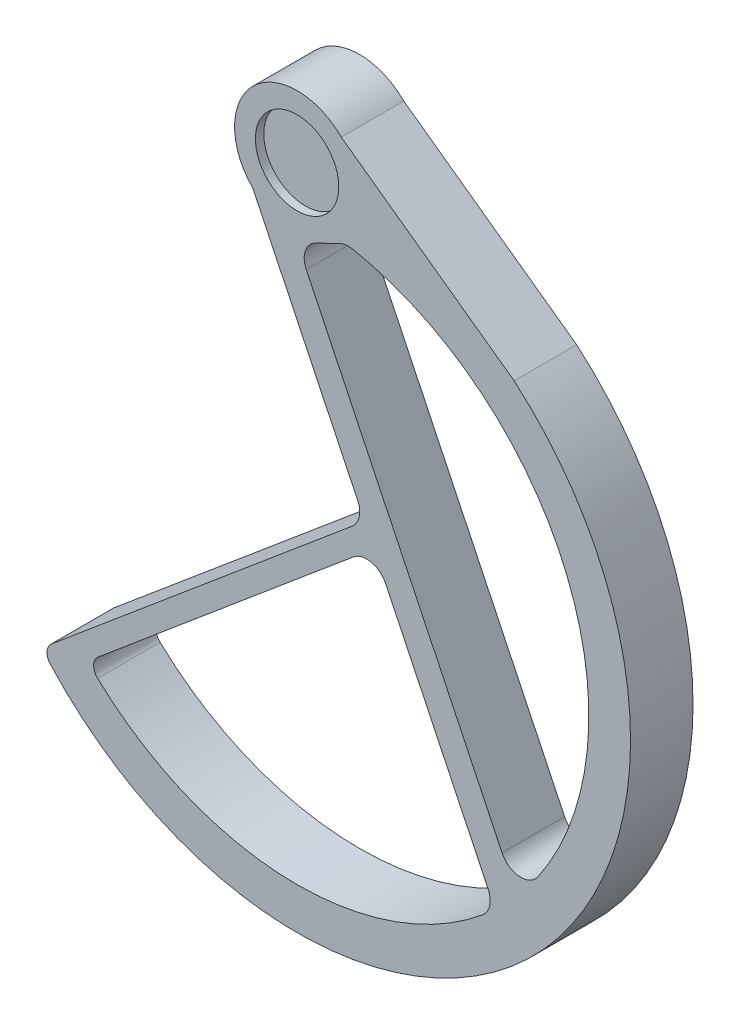
ISO-10303-21;
HEADER;
FILE_DESCRIPTION(('STEP AP214'),'2;1');
FILE_NAME('part.step','',(''),(''),'','','');
FILE_SCHEMA(('AUTOMOTIVE_DESIGN { 1 0 10303 214 1 1 1 1 }'));
ENDSEC;
DATA;
#1=APPLICATION_CONTEXT('core data for automotive mechanical design processes');
#2=APPLICATION_PROTOCOL_DEFINITION('international standard','automotive_design',2000,#1);
#3=PRODUCT_CONTEXT('',#1,'mechanical');
#4=PRODUCT('Part','Part','',(#3));
#5=PRODUCT_RELATED_PRODUCT_CATEGORY('part','',(#4));
#6=PRODUCT_DEFINITION_FORMATION('','',#4);
#7=PRODUCT_DEFINITION_CONTEXT('part definition',#1,'design');
#8=PRODUCT_DEFINITION('design','',#6,#7);
#9=PRODUCT_DEFINITION_SHAPE('','',#8);
#10=(LENGTH_UNIT() NAMED_UNIT(*) SI_UNIT(.MILLI.,.METRE.));
#11=(NAMED_UNIT(*) PLANE_ANGLE_UNIT() SI_UNIT($,.RADIAN.));
#12=(NAMED_UNIT(*) SI_UNIT($,.STERADIAN.) SOLID_ANGLE_UNIT());
#13=UNCERTAINTY_MEASURE_WITH_UNIT(LENGTH_MEASURE(1.E-05),#10,'distance_accuracy_value','');
#14=(GEOMETRIC_REPRESENTATION_CONTEXT(3) GLOBAL_UNCERTAINTY_ASSIGNED_CONTEXT((#13)) GLOBAL_UNIT_ASSIGNED_CONTEXT((#10,
#11,#12)) REPRESENTATION_CONTEXT('',''));
#15=CARTESIAN_POINT('',(0.,0.,0.));
#16=DIRECTION('',(0.,0.,1.));
#17=DIRECTION('',(1.,0.,0.));
#18=AXIS2_PLACEMENT_3D('',#15,#16,#17);
#19=CARTESIAN_POINT('',(-12.7570586950624,-6.1348621133076,15.));
#20=DIRECTION('',(0.901206602628173,0.433389731511241,0.));
#21=DIRECTION('',(-0.433389731511241,0.901206602628173,0.));
#22=AXIS2_PLACEMENT_3D('',#19,#20,#21);
#23=PLANE('',#22);
#24=DIRECTION('',(0.433389731511241,-0.901206602628173,0.));
#25=VECTOR('',#24,1.);
#26=CARTESIAN_POINT('',(-12.7570586950624,-6.1348621133076,0.));
#27=LINE('',#26,#25);
#28=CARTESIAN_POINT('',(21.2324006956412,-76.8137984043253,0.));
#29=VERTEX_POINT('',#28);
#30=CARTESIAN_POINT('',(45.844843506453,-127.9938203457,0.));
#31=VERTEX_POINT('',#30);
#32=EDGE_CURVE('E278',#29,#31,#27,.T.);
#33=ORIENTED_EDGE('',*,*,#32,.T.);
#34=DIRECTION('',(0.,0.,-1.));
#35=VECTOR('',#34,1.);
#36=CARTESIAN_POINT('',(45.844843506453,-127.9938203457,15.));
#37=LINE('',#36,#35);
#38=CARTESIAN_POINT('',(45.844843506453,-127.9938203457,15.));
#39=VERTEX_POINT('',#38);
#40=EDGE_CURVE('E11',#39,#31,#37,.T.);
#41=ORIENTED_EDGE('',*,*,#40,.F.);
#42=DIRECTION('',(0.433389731511241,-0.901206602628173,0.));
#43=VECTOR('',#42,1.);
#44=CARTESIAN_POINT('',(-12.7570586950624,-6.1348621133076,15.));
#45=LINE('',#44,#43);
#46=CARTESIAN_POINT('',(21.2324006956412,-76.8137984043253,15.));
#47=VERTEX_POINT('',#46);
#48=EDGE_CURVE('E244',#47,#39,#45,.T.);
#49=ORIENTED_EDGE('',*,*,#48,.F.);
#50=DIRECTION('',(0.,0.,-1.));
#51=VECTOR('',#50,1.);
#52=CARTESIAN_POINT('',(21.2324006956412,-76.8137984043253,15.));
#53=LINE('',#52,#51);
#54=EDGE_CURVE('E292',#47,#29,#53,.T.);
#55=ORIENTED_EDGE('',*,*,#54,.T.);
#56=EDGE_LOOP('',(#33,#41,#49,#55));
#57=FACE_BOUND('',#56,.T.);
#58=ADVANCED_FACE('F35',(#57),#23,.F.);
#59=CARTESIAN_POINT('',(41.3388104933121,-130.160769003256,15.));
#60=DIRECTION('',(0.,0.,-1.));
#61=DIRECTION('',(-1.,0.,0.));
#62=AXIS2_PLACEMENT_3D('',#59,#60,#61);
#63=CYLINDRICAL_SURFACE('',#62,4.99999999999999);
#64=CARTESIAN_POINT('',(41.3388104933121,-130.160769003256,0.));
#65=DIRECTION('',(0.,0.,1.));
#66=DIRECTION('',(1.,0.,0.));
#67=AXIS2_PLACEMENT_3D('',#64,#65,#66);
#68=CIRCLE('',#67,4.99999999999999);
#69=CARTESIAN_POINT('',(44.5187189927976,-134.019289695814,0.));
#70=VERTEX_POINT('',#69);
#71=EDGE_CURVE('E281',#31,#70,#68,.F.);
#72=ORIENTED_EDGE('',*,*,#71,.T.);
#73=DIRECTION('',(0.,0.,-1.));
#74=VECTOR('',#73,1.);
#75=CARTESIAN_POINT('',(44.5187189927976,-134.019289695814,15.));
#76=LINE('',#75,#74);
#77=CARTESIAN_POINT('',(44.5187189927976,-134.019289695814,15.));
#78=VERTEX_POINT('',#77);
#79=EDGE_CURVE('E44',#78,#70,#76,.T.);
#80=ORIENTED_EDGE('',*,*,#79,.F.);
#81=CARTESIAN_POINT('',(41.3388104933121,-130.160769003256,15.));
#82=DIRECTION('',(0.,0.,1.));
#83=DIRECTION('',(1.,0.,0.));
#84=AXIS2_PLACEMENT_3D('',#81,#82,#83);
#85=CIRCLE('',#84,4.99999999999999);
#86=EDGE_CURVE('E247',#39,#78,#85,.F.);
#87=ORIENTED_EDGE('',*,*,#86,.F.);
#88=ORIENTED_EDGE('',*,*,#40,.T.);
#89=EDGE_LOOP('',(#72,#80,#87,#88));
#90=FACE_BOUND('',#89,.T.);
#91=ADVANCED_FACE('F358',(#90),#63,.F.);
#92=CARTESIAN_POINT('',(0.,-80.,15.));
#93=DIRECTION('',(0.,0.,-1.));
#94=DIRECTION('',(-1.,0.,0.));
#95=AXIS2_PLACEMENT_3D('',#92,#93,#94);
#96=CYLINDRICAL_SURFACE('',#95,70.);
#97=CARTESIAN_POINT('',(0.,-80.,0.));
#98=DIRECTION('',(0.,0.,1.));
#99=DIRECTION('',(1.,0.,0.));
#100=AXIS2_PLACEMENT_3D('',#97,#98,#99);
#101=CIRCLE('',#100,70.);
#102=CARTESIAN_POINT('',(-47.870174388264,-131.072951785042,0.));
#103=VERTEX_POINT('',#102);
#104=EDGE_CURVE('E284',#103,#70,#101,.T.);
#105=ORIENTED_EDGE('',*,*,#104,.F.);
#106=DIRECTION('',(0.,0.,-1.));
#107=VECTOR('',#106,1.);
#108=CARTESIAN_POINT('',(-47.870174388264,-131.072951785042,15.));
#109=LINE('',#108,#107);
#110=CARTESIAN_POINT('',(-47.870174388264,-131.072951785042,15.));
#111=VERTEX_POINT('',#110);
#112=EDGE_CURVE('E301',#111,#103,#109,.T.);
#113=ORIENTED_EDGE('',*,*,#112,.F.);
#114=CARTESIAN_POINT('',(0.,-80.,15.));
#115=DIRECTION('',(0.,0.,1.));
#116=DIRECTION('',(1.,0.,0.));
#117=AXIS2_PLACEMENT_3D('',#114,#115,#116);
#118=CIRCLE('',#117,70.);
#119=EDGE_CURVE('E249',#111,#78,#118,.T.);
#120=ORIENTED_EDGE('',*,*,#119,.T.);
#121=ORIENTED_EDGE('',*,*,#79,.T.);
#122=EDGE_LOOP('',(#105,#113,#120,#121));
#123=FACE_BOUND('',#122,.T.);
#124=ADVANCED_FACE('F364',(#123),#96,.F.);
#125=CARTESIAN_POINT('',(-45.8185954859101,-128.884110994254,15.));
#126=DIRECTION('',(0.,0.,-1.));
#127=DIRECTION('',(-1.,0.,0.));
#128=AXIS2_PLACEMENT_3D('',#125,#126,#127);
#129=CYLINDRICAL_SURFACE('',#128,2.99999999999979);
#130=CARTESIAN_POINT('',(-45.8185954859101,-128.884110994254,0.));
#131=DIRECTION('',(0.,0.,1.));
#132=DIRECTION('',(1.,0.,0.));
#133=AXIS2_PLACEMENT_3D('',#130,#131,#132);
#134=CIRCLE('',#133,2.99999999999979);
#135=CARTESIAN_POINT('',(-47.7476784165524,-126.586582094174,0.));
#136=VERTEX_POINT('',#135);
#137=EDGE_CURVE('E287',#103,#136,#134,.F.);
#138=ORIENTED_EDGE('',*,*,#137,.T.);
#139=DIRECTION('',(0.,0.,-1.));
#140=VECTOR('',#139,1.);
#141=CARTESIAN_POINT('',(-47.7476784165524,-126.586582094174,15.));
#142=LINE('',#141,#140);
#143=CARTESIAN_POINT('',(-47.7476784165524,-126.586582094174,15.));
#144=VERTEX_POINT('',#143);
#145=EDGE_CURVE('E298',#144,#136,#142,.T.);
#146=ORIENTED_EDGE('',*,*,#145,.F.);
#147=CARTESIAN_POINT('',(-45.8185954859101,-128.884110994254,15.));
#148=DIRECTION('',(0.,0.,1.));
#149=DIRECTION('',(1.,0.,0.));
#150=AXIS2_PLACEMENT_3D('',#147,#148,#149);
#151=CIRCLE('',#150,2.99999999999979);
#152=EDGE_CURVE('E252',#111,#144,#151,.F.);
#153=ORIENTED_EDGE('',*,*,#152,.F.);
#154=ORIENTED_EDGE('',*,*,#112,.T.);
#155=EDGE_LOOP('',(#138,#146,#153,#154));
#156=FACE_BOUND('',#155,.T.);
#157=ADVANCED_FACE('F370',(#156),#129,.F.);
#158=CARTESIAN_POINT('',(42.5956727933285,-50.7312504333006,15.));
#159=DIRECTION('',(-0.643027643547508,0.765842966693394,0.));
#160=DIRECTION('',(-0.765842966693394,-0.643027643547508,0.));
#161=AXIS2_PLACEMENT_3D('',#158,#159,#160);
#162=PLANE('',#161);
#163=DIRECTION('',(0.765842966693394,0.643027643547508,0.));
#164=VECTOR('',#163,1.);
#165=CARTESIAN_POINT('',(42.5956727933285,-50.7312504333006,0.));
#166=LINE('',#165,#164);
#167=CARTESIAN_POINT('',(13.5112294647628,-75.1515322284145,0.));
#168=VERTEX_POINT('',#167);
#169=EDGE_CURVE('E289',#136,#168,#166,.T.);
#170=ORIENTED_EDGE('',*,*,#169,.T.);
#171=DIRECTION('',(0.,0.,-1.));
#172=VECTOR('',#171,1.);
#173=CARTESIAN_POINT('',(13.5112294647628,-75.1515322284145,15.));
#174=LINE('',#173,#172);
#175=CARTESIAN_POINT('',(13.5112294647628,-75.1515322284145,15.));
#176=VERTEX_POINT('',#175);
#177=EDGE_CURVE('E295',#176,#168,#174,.T.);
#178=ORIENTED_EDGE('',*,*,#177,.F.);
#179=DIRECTION('',(0.765842966693394,0.643027643547508,0.));
#180=VECTOR('',#179,1.);
#181=CARTESIAN_POINT('',(42.5956727933285,-50.7312504333006,15.));
#182=LINE('',#181,#180);
#183=EDGE_CURVE('E254',#144,#176,#182,.T.);
#184=ORIENTED_EDGE('',*,*,#183,.F.);
#185=ORIENTED_EDGE('',*,*,#145,.T.);
#186=EDGE_LOOP('',(#170,#178,#184,#185));
#187=FACE_BOUND('',#186,.T.);
#188=ADVANCED_FACE('F374',(#187),#162,.F.);
#189=CARTESIAN_POINT('',(10.0302471408598,-65.0565868768263,15.));
#190=DIRECTION('',(0.,0.,-1.));
#191=DIRECTION('',(-1.,0.,0.));
#192=AXIS2_PLACEMENT_3D('',#189,#190,#191);
#193=CYLINDRICAL_SURFACE('',#192,5.);
#194=CARTESIAN_POINT('',(10.0302471408598,-65.0565868768263,0.));
#195=DIRECTION('',(0.,0.,1.));
#196=DIRECTION('',(1.,0.,0.));
#197=AXIS2_PLACEMENT_3D('',#194,#195,#196);
#198=CIRCLE('',#197,5.);
#199=CARTESIAN_POINT('',(13.2441851892925,-68.8868090924212,0.));
#200=VERTEX_POINT('',#199);
#201=CARTESIAN_POINT('',(14.5362801540007,-62.8896382192701,0.));
#202=VERTEX_POINT('',#201);
#203=EDGE_CURVE('E217',#200,#202,#198,.T.);
#204=ORIENTED_EDGE('',*,*,#203,.F.);
#205=DIRECTION('',(0.,0.,-1.));
#206=VECTOR('',#205,1.);
#207=CARTESIAN_POINT('',(13.2441851892925,-68.8868090924212,15.));
#208=LINE('',#207,#206);
#209=CARTESIAN_POINT('',(13.2441851892925,-68.8868090924212,15.));
#210=VERTEX_POINT('',#209);
#211=EDGE_CURVE('E39',#210,#200,#208,.T.);
#212=ORIENTED_EDGE('',*,*,#211,.F.);
#213=CARTESIAN_POINT('',(10.0302471408598,-65.0565868768263,15.));
#214=DIRECTION('',(0.,0.,1.));
#215=DIRECTION('',(1.,0.,0.));
#216=AXIS2_PLACEMENT_3D('',#213,#214,#215);
#217=CIRCLE('',#216,5.);
#218=CARTESIAN_POINT('',(14.5362801540007,-62.8896382192701,15.));
#219=VERTEX_POINT('',#218);
#220=EDGE_CURVE('E225',#210,#219,#217,.T.);
#221=ORIENTED_EDGE('',*,*,#220,.T.);
#222=DIRECTION('',(0.,0.,-1.));
#223=VECTOR('',#222,1.);
#224=CARTESIAN_POINT('',(14.5362801540007,-62.8896382192701,15.));
#225=LINE('',#224,#223);
#226=EDGE_CURVE('E258',#219,#202,#225,.T.);
#227=ORIENTED_EDGE('',*,*,#226,.T.);
#228=EDGE_LOOP('',(#204,#212,#221,#227));
#229=FACE_BOUND('',#228,.T.);
#230=ADVANCED_FACE('F37',(#229),#193,.F.);
#231=CARTESIAN_POINT('',(39.3923101204882,-46.9459271066778,15.));
#232=DIRECTION('',(-0.642787609686534,0.766044443118983,0.));
#233=DIRECTION('',(-0.766044443118982,-0.642787609686534,0.));
#234=AXIS2_PLACEMENT_3D('',#231,#232,#233);
#235=PLANE('',#234);
#236=DIRECTION('',(0.766044443118982,0.642787609686534,0.));
#237=VECTOR('',#236,1.);
#238=CARTESIAN_POINT('',(39.3923101204882,-46.9459271066778,0.));
#239=LINE('',#238,#237);
#240=CARTESIAN_POINT('',(-58.9406362868111,-129.457066169617,0.));
#241=VERTEX_POINT('',#240);
#242=EDGE_CURVE('E261',#241,#200,#239,.T.);
#243=ORIENTED_EDGE('',*,*,#242,.F.);
#244=DIRECTION('',(0.,0.,-1.));
#245=VECTOR('',#244,1.);
#246=CARTESIAN_POINT('',(-58.9406362868111,-129.457066169617,15.));
#247=LINE('',#246,#245);
#248=CARTESIAN_POINT('',(-58.9406362868111,-129.457066169617,15.));
#249=VERTEX_POINT('',#248);
#250=EDGE_CURVE('E313',#249,#241,#247,.T.);
#251=ORIENTED_EDGE('',*,*,#250,.F.);
#252=DIRECTION('',(0.766044443118982,0.642787609686534,0.));
#253=VECTOR('',#252,1.);
#254=CARTESIAN_POINT('',(39.3923101204882,-46.9459271066778,15.));
#255=LINE('',#254,#253);
#256=EDGE_CURVE('E228',#249,#210,#255,.T.);
#257=ORIENTED_EDGE('',*,*,#256,.T.);
#258=ORIENTED_EDGE('',*,*,#211,.T.);
#259=EDGE_LOOP('',(#243,#251,#257,#258));
#260=FACE_BOUND('',#259,.T.);
#261=ADVANCED_FACE('F319',(#260),#235,.T.);
#262=CARTESIAN_POINT('',(-57.0122734577518,-131.755199498973,15.));
#263=DIRECTION('',(0.,0.,-1.));
#264=DIRECTION('',(-1.,0.,0.));
#265=AXIS2_PLACEMENT_3D('',#262,#263,#264);
#266=CYLINDRICAL_SURFACE('',#265,2.99999999999976);
#267=CARTESIAN_POINT('',(-57.0122734577518,-131.755199498973,0.));
#268=DIRECTION('',(0.,0.,1.));
#269=DIRECTION('',(1.,0.,0.));
#270=AXIS2_PLACEMENT_3D('',#267,#268,#269);
#271=CIRCLE('',#270,2.99999999999976);
#272=CARTESIAN_POINT('',(-59.2335308651964,-133.771635843089,0.));
#273=VERTEX_POINT('',#272);
#274=EDGE_CURVE('E264',#273,#241,#271,.F.);
#275=ORIENTED_EDGE('',*,*,#274,.F.);
#276=DIRECTION('',(0.,0.,-1.));
#277=VECTOR('',#276,1.);
#278=CARTESIAN_POINT('',(-59.2335308651964,-133.771635843089,15.));
#279=LINE('',#278,#277);
#280=CARTESIAN_POINT('',(-59.2335308651964,-133.771635843089,15.));
#281=VERTEX_POINT('',#280);
#282=EDGE_CURVE('E312',#281,#273,#279,.T.);
#283=ORIENTED_EDGE('',*,*,#282,.F.);
#284=CARTESIAN_POINT('',(-57.0122734577518,-131.755199498973,15.));
#285=DIRECTION('',(0.,0.,1.));
#286=DIRECTION('',(1.,0.,0.));
#287=AXIS2_PLACEMENT_3D('',#284,#285,#286);
#288=CIRCLE('',#287,2.99999999999976);
#289=EDGE_CURVE('E232',#281,#249,#288,.F.);
#290=ORIENTED_EDGE('',*,*,#289,.T.);
#291=ORIENTED_EDGE('',*,*,#250,.T.);
#292=EDGE_LOOP('',(#275,#283,#290,#291));
#293=FACE_BOUND('',#292,.T.);
#294=ADVANCED_FACE('F327',(#293),#266,.T.);
#295=CARTESIAN_POINT('',(0.,-80.,15.));
#296=DIRECTION('',(0.,0.,-1.));
#297=DIRECTION('',(-1.,0.,0.));
#298=AXIS2_PLACEMENT_3D('',#295,#296,#297);
#299=CYLINDRICAL_SURFACE('',#298,80.);
#300=CARTESIAN_POINT('',(0.,-80.,0.));
#301=DIRECTION('',(0.,0.,1.));
#302=DIRECTION('',(1.,0.,0.));
#303=AXIS2_PLACEMENT_3D('',#300,#301,#302);
#304=CIRCLE('',#303,80.);
#305=CARTESIAN_POINT('',(52.0761789176773,-19.2705047828153,0.));
#306=VERTEX_POINT('',#305);
#307=EDGE_CURVE('E267',#273,#306,#304,.T.);
#308=ORIENTED_EDGE('',*,*,#307,.T.);
#309=DIRECTION('',(0.,0.,-1.));
#310=VECTOR('',#309,1.);
#311=CARTESIAN_POINT('',(52.0761789176773,-19.2705047828153,15.));
#312=LINE('',#311,#310);
#313=CARTESIAN_POINT('',(52.0761789176773,-19.2705047828153,15.));
#314=VERTEX_POINT('',#313);
#315=EDGE_CURVE('E310',#314,#306,#312,.T.);
#316=ORIENTED_EDGE('',*,*,#315,.F.);
#317=CARTESIAN_POINT('',(0.,-80.,15.));
#318=DIRECTION('',(0.,0.,1.));
#319=DIRECTION('',(1.,0.,0.));
#320=AXIS2_PLACEMENT_3D('',#317,#318,#319);
#321=CIRCLE('',#320,80.);
#322=EDGE_CURVE('E235',#281,#314,#321,.T.);
#323=ORIENTED_EDGE('',*,*,#322,.F.);
#324=ORIENTED_EDGE('',*,*,#282,.T.);
#325=EDGE_LOOP('',(#308,#316,#323,#324));
#326=FACE_BOUND('',#325,.T.);
#327=ADVANCED_FACE('F332',(#326),#299,.T.);
#328=CARTESIAN_POINT('',(8.65474635415258,12.0128323695446,15.));
#329=DIRECTION('',(0.584549661802916,0.811357931424902,0.));
#330=DIRECTION('',(-0.811357931424902,0.584549661802916,0.));
#331=AXIS2_PLACEMENT_3D('',#328,#329,#330);
#332=PLANE('',#331);
#333=DIRECTION('',(0.811357931424902,-0.584549661802916,0.));
#334=VECTOR('',#333,1.);
#335=CARTESIAN_POINT('',(8.65474635415258,12.0128323695446,0.));
#336=LINE('',#335,#334);
#337=CARTESIAN_POINT('',(10.6066017177981,10.6066017177983,0.));
#338=VERTEX_POINT('',#337);
#339=EDGE_CURVE('E270',#338,#306,#336,.T.);
#340=ORIENTED_EDGE('',*,*,#339,.F.);
#341=DIRECTION('',(0.,0.,-1.));
#342=VECTOR('',#341,1.);
#343=CARTESIAN_POINT('',(10.6066017177981,10.6066017177983,15.));
#344=LINE('',#343,#342);
#345=CARTESIAN_POINT('',(10.6066017177981,10.6066017177983,15.));
#346=VERTEX_POINT('',#345);
#347=EDGE_CURVE('E308',#346,#338,#344,.T.);
#348=ORIENTED_EDGE('',*,*,#347,.F.);
#349=DIRECTION('',(0.811357931424902,-0.584549661802916,0.));
#350=VECTOR('',#349,1.);
#351=CARTESIAN_POINT('',(8.65474635415258,12.0128323695446,15.));
#352=LINE('',#351,#350);
#353=EDGE_CURVE('E237',#346,#314,#352,.T.);
#354=ORIENTED_EDGE('',*,*,#353,.T.);
#355=ORIENTED_EDGE('',*,*,#315,.T.);
#356=EDGE_LOOP('',(#340,#348,#354,#355));
#357=FACE_BOUND('',#356,.T.);
#358=ADVANCED_FACE('F346',(#357),#332,.T.);
#359=CARTESIAN_POINT('',(0.,0.,15.));
#360=DIRECTION('',(0.,0.,-1.));
#361=DIRECTION('',(-1.,0.,0.));
#362=AXIS2_PLACEMENT_3D('',#359,#360,#361);
#363=CYLINDRICAL_SURFACE('',#362,15.);
#364=CARTESIAN_POINT('',(0.,0.,0.));
#365=DIRECTION('',(0.,0.,1.));
#366=DIRECTION('',(1.,0.,0.));
#367=AXIS2_PLACEMENT_3D('',#364,#365,#366);
#368=CIRCLE('',#367,15.);
#369=CARTESIAN_POINT('',(-10.6066017177981,-10.6066017177983,0.));
#370=VERTEX_POINT('',#369);
#371=EDGE_CURVE('E273',#338,#370,#368,.T.);
#372=ORIENTED_EDGE('',*,*,#371,.T.);
#373=DIRECTION('',(0.,0.,-1.));
#374=VECTOR('',#373,1.);
#375=CARTESIAN_POINT('',(-10.6066017177981,-10.6066017177983,15.));
#376=LINE('',#375,#374);
#377=CARTESIAN_POINT('',(-10.6066017177981,-10.6066017177983,15.));
#378=VERTEX_POINT('',#377);
#379=EDGE_CURVE('E305',#378,#370,#376,.T.);
#380=ORIENTED_EDGE('',*,*,#379,.F.);
#381=CARTESIAN_POINT('',(0.,0.,15.));
#382=DIRECTION('',(0.,0.,1.));
#383=DIRECTION('',(1.,0.,0.));
#384=AXIS2_PLACEMENT_3D('',#381,#382,#383);
#385=CIRCLE('',#384,15.);
#386=EDGE_CURVE('E240',#346,#378,#385,.T.);
#387=ORIENTED_EDGE('',*,*,#386,.F.);
#388=ORIENTED_EDGE('',*,*,#347,.T.);
#389=EDGE_LOOP('',(#372,#380,#387,#388));
#390=FACE_BOUND('',#389,.T.);
#391=ADVANCED_FACE('F347',(#390),#363,.T.);
#392=CARTESIAN_POINT('',(-12.7570586950624,-6.13486211330761,15.));
#393=DIRECTION('',(0.901206602628173,0.433389731511242,0.));
#394=DIRECTION('',(-0.433389731511242,0.901206602628173,0.));
#395=AXIS2_PLACEMENT_3D('',#392,#393,#394);
#396=PLANE('',#395);
#397=DIRECTION('',(0.433389731511242,-0.901206602628173,0.));
#398=VECTOR('',#397,1.);
#399=CARTESIAN_POINT('',(-12.7570586950624,-6.13486211330761,0.));
#400=LINE('',#399,#398);
#401=EDGE_CURVE('E275',#370,#202,#400,.T.);
#402=ORIENTED_EDGE('',*,*,#401,.T.);
#403=ORIENTED_EDGE('',*,*,#226,.F.);
#404=DIRECTION('',(0.433389731511242,-0.901206602628173,0.));
#405=VECTOR('',#404,1.);
#406=CARTESIAN_POINT('',(-12.7570586950624,-6.13486211330761,15.));
#407=LINE('',#406,#405);
#408=EDGE_CURVE('E242',#378,#219,#407,.T.);
#409=ORIENTED_EDGE('',*,*,#408,.F.);
#410=ORIENTED_EDGE('',*,*,#379,.T.);
#411=EDGE_LOOP('',(#402,#403,#409,#410));
#412=FACE_BOUND('',#411,.T.);
#413=ADVANCED_FACE('F341',(#412),#396,.F.);
#414=CARTESIAN_POINT('',(16.7263676825004,-78.9807470618814,15.));
#415=DIRECTION('',(0.,0.,-1.));
#416=DIRECTION('',(-1.,0.,0.));
#417=AXIS2_PLACEMENT_3D('',#414,#415,#416);
#418=CYLINDRICAL_SURFACE('',#417,5.);
#419=CARTESIAN_POINT('',(16.7263676825004,-78.9807470618814,0.));
#420=DIRECTION('',(0.,0.,1.));
#421=DIRECTION('',(1.,0.,0.));
#422=AXIS2_PLACEMENT_3D('',#419,#420,#421);
#423=CIRCLE('',#422,5.);
#424=EDGE_CURVE('E229',#168,#29,#423,.F.);
#425=ORIENTED_EDGE('',*,*,#424,.T.);
#426=ORIENTED_EDGE('',*,*,#54,.F.);
#427=CARTESIAN_POINT('',(16.7263676825004,-78.9807470618814,15.));
#428=DIRECTION('',(0.,0.,1.));
#429=DIRECTION('',(1.,0.,0.));
#430=AXIS2_PLACEMENT_3D('',#427,#428,#429);
#431=CIRCLE('',#430,5.);
#432=EDGE_CURVE('E256',#176,#47,#431,.F.);
#433=ORIENTED_EDGE('',*,*,#432,.F.);
#434=ORIENTED_EDGE('',*,*,#177,.T.);
#435=EDGE_LOOP('',(#425,#426,#433,#434));
#436=FACE_BOUND('',#435,.T.);
#437=ADVANCED_FACE('F354',(#436),#418,.F.);
#438=CARTESIAN_POINT('',(0.,0.,15.));
#439=DIRECTION('',(0.,0.,1.));
#440=DIRECTION('',(1.,0.,0.));
#441=AXIS2_PLACEMENT_3D('',#438,#439,#440);
#442=PLANE('',#441);
#443=CARTESIAN_POINT('',(0.,0.,15.));
#444=DIRECTION('',(0.,0.,1.));
#445=DIRECTION('',(1.,0.,0.));
#446=AXIS2_PLACEMENT_3D('',#443,#444,#445);
#447=CIRCLE('',#446,10.);
#448=CARTESIAN_POINT('',(10.,0.,15.));
#449=VERTEX_POINT('',#448);
#450=EDGE_CURVE('E193',#449,#449,#447,.T.);
#451=ORIENTED_EDGE('',*,*,#450,.F.);
#452=EDGE_LOOP('',(#451));
#453=FACE_BOUND('',#452,.T.);
#454=CARTESIAN_POINT('',(6.70778479931193,-18.9220720384942,15.));
#455=DIRECTION('',(0.,0.,1.));
#456=DIRECTION('',(-1.,0.,0.));
#457=AXIS2_PLACEMENT_3D('',#454,#455,#456);
#458=CIRCLE('',#457,5.);
#459=CARTESIAN_POINT('',(4.54083614175573,-14.4160390253533,15.));
#460=VERTEX_POINT('',#459);
#461=CARTESIAN_POINT('',(2.20175178617109,-21.0890206960504,15.));
#462=VERTEX_POINT('',#461);
#463=EDGE_CURVE('E52',#460,#462,#458,.T.);
#464=ORIENTED_EDGE('',*,*,#463,.F.);
#465=DIRECTION('',(-0.901206602628171,-0.433389731511247,0.));
#466=VECTOR('',#465,1.);
#467=CARTESIAN_POINT('',(6.4834156052804,-13.4818536901804,15.));
#468=LINE('',#467,#466);
#469=CARTESIAN_POINT('',(10.2196588467731,-11.6850964864837,15.));
#470=VERTEX_POINT('',#469);
#471=EDGE_CURVE('E187',#470,#460,#468,.T.);
#472=ORIENTED_EDGE('',*,*,#471,.F.);
#473=CARTESIAN_POINT('',(12.3866075043293,-16.1911294996245,15.));
#474=DIRECTION('',(0.,0.,1.));
#475=DIRECTION('',(1.,0.,0.));
#476=AXIS2_PLACEMENT_3D('',#473,#474,#475);
#477=CIRCLE('',#476,5.);
#478=CARTESIAN_POINT('',(13.3394234662008,-11.2827548457495,15.));
#479=VERTEX_POINT('',#478);
#480=EDGE_CURVE('E190',#479,#470,#477,.T.);
#481=ORIENTED_EDGE('',*,*,#480,.F.);
#482=CARTESIAN_POINT('',(0.,-80.,15.));
#483=DIRECTION('',(0.,0.,1.));
#484=DIRECTION('',(1.,0.,0.));
#485=AXIS2_PLACEMENT_3D('',#482,#483,#484);
#486=CIRCLE('',#485,69.9999999999999);
#487=CARTESIAN_POINT('',(57.8260553336624,-119.448033215209,15.));
#488=VERTEX_POINT('',#487);
#489=EDGE_CURVE('E210',#488,#479,#486,.T.);
#490=ORIENTED_EDGE('',*,*,#489,.F.);
#491=CARTESIAN_POINT('',(53.6956228098294,-116.63031655698,15.));
#492=DIRECTION('',(0.,0.,1.));
#493=DIRECTION('',(-1.,0.,0.));
#494=AXIS2_PLACEMENT_3D('',#491,#492,#493);
#495=CIRCLE('',#494,5.);
#496=CARTESIAN_POINT('',(49.1895897966885,-118.797265214536,15.));
#497=VERTEX_POINT('',#496);
#498=EDGE_CURVE('E207',#497,#488,#495,.T.);
#499=ORIENTED_EDGE('',*,*,#498,.F.);
#500=DIRECTION('',(0.433389731511244,-0.901206602628172,0.));
#501=VECTOR('',#500,1.);
#502=CARTESIAN_POINT('',(49.1895897966885,-118.797265214536,15.));
#503=LINE('',#502,#501);
#504=EDGE_CURVE('E204',#462,#497,#503,.T.);
#505=ORIENTED_EDGE('',*,*,#504,.F.);
#506=EDGE_LOOP('',(#464,#472,#481,#490,#499,#505));
#507=FACE_BOUND('',#506,.T.);
#508=ORIENTED_EDGE('',*,*,#220,.F.);
#509=ORIENTED_EDGE('',*,*,#256,.F.);
#510=ORIENTED_EDGE('',*,*,#289,.F.);
#511=ORIENTED_EDGE('',*,*,#322,.T.);
#512=ORIENTED_EDGE('',*,*,#353,.F.);
#513=ORIENTED_EDGE('',*,*,#386,.T.);
#514=ORIENTED_EDGE('',*,*,#408,.T.);
#515=EDGE_LOOP('',(#508,#509,#510,#511,#512,#513,#514));
#516=FACE_BOUND('',#515,.T.);
#517=ORIENTED_EDGE('',*,*,#48,.T.);
#518=ORIENTED_EDGE('',*,*,#86,.T.);
#519=ORIENTED_EDGE('',*,*,#119,.F.);
#520=ORIENTED_EDGE('',*,*,#152,.T.);
#521=ORIENTED_EDGE('',*,*,#183,.T.);
#522=ORIENTED_EDGE('',*,*,#432,.T.);
#523=EDGE_LOOP('',(#517,#518,#519,#520,#521,#522));
#524=FACE_BOUND('',#523,.T.);
#525=ADVANCED_FACE('F335',(#453,#507,#516,#524),#442,.T.);
#526=CARTESIAN_POINT('',(0.,0.,0.));
#527=DIRECTION('',(0.,0.,1.));
#528=DIRECTION('',(1.,0.,0.));
#529=AXIS2_PLACEMENT_3D('',#526,#527,#528);
#530=PLANE('',#529);
#531=DIRECTION('',(-0.90120660262817,-0.433389731511248,0.));
#532=VECTOR('',#531,1.);
#533=CARTESIAN_POINT('',(6.4834156052804,-13.4818536901804,0.));
#534=LINE('',#533,#532);
#535=CARTESIAN_POINT('',(10.2196588467731,-11.6850964864837,0.));
#536=VERTEX_POINT('',#535);
#537=CARTESIAN_POINT('',(4.54083614175573,-14.4160390253533,0.));
#538=VERTEX_POINT('',#537);
#539=EDGE_CURVE('E176',#536,#538,#534,.T.);
#540=ORIENTED_EDGE('',*,*,#539,.T.);
#541=CARTESIAN_POINT('',(6.70778479931193,-18.9220720384942,0.));
#542=DIRECTION('',(0.,0.,1.));
#543=DIRECTION('',(-1.,0.,0.));
#544=AXIS2_PLACEMENT_3D('',#541,#542,#543);
#545=CIRCLE('',#544,5.);
#546=CARTESIAN_POINT('',(2.20175178617109,-21.0890206960504,0.));
#547=VERTEX_POINT('',#546);
#548=EDGE_CURVE('E170',#538,#547,#545,.T.);
#549=ORIENTED_EDGE('',*,*,#548,.T.);
#550=DIRECTION('',(0.433389731511244,-0.901206602628172,0.));
#551=VECTOR('',#550,1.);
#552=CARTESIAN_POINT('',(49.1895897966885,-118.797265214536,0.));
#553=LINE('',#552,#551);
#554=CARTESIAN_POINT('',(49.1895897966885,-118.797265214536,0.));
#555=VERTEX_POINT('',#554);
#556=EDGE_CURVE('E179',#547,#555,#553,.T.);
#557=ORIENTED_EDGE('',*,*,#556,.T.);
#558=CARTESIAN_POINT('',(53.6956228098294,-116.63031655698,0.));
#559=DIRECTION('',(0.,0.,1.));
#560=DIRECTION('',(-1.,0.,0.));
#561=AXIS2_PLACEMENT_3D('',#558,#559,#560);
#562=CIRCLE('',#561,5.);
#563=CARTESIAN_POINT('',(57.8260553336624,-119.448033215209,0.));
#564=VERTEX_POINT('',#563);
#565=EDGE_CURVE('E60',#555,#564,#562,.T.);
#566=ORIENTED_EDGE('',*,*,#565,.T.);
#567=CARTESIAN_POINT('',(0.,-80.,0.));
#568=DIRECTION('',(0.,0.,1.));
#569=DIRECTION('',(1.,0.,0.));
#570=AXIS2_PLACEMENT_3D('',#567,#568,#569);
#571=CIRCLE('',#570,69.9999999999999);
#572=CARTESIAN_POINT('',(13.3394234662008,-11.2827548457495,0.));
#573=VERTEX_POINT('',#572);
#574=EDGE_CURVE('E197',#564,#573,#571,.T.);
#575=ORIENTED_EDGE('',*,*,#574,.T.);
#576=CARTESIAN_POINT('',(12.3866075043293,-16.1911294996245,0.));
#577=DIRECTION('',(0.,0.,1.));
#578=DIRECTION('',(1.,0.,0.));
#579=AXIS2_PLACEMENT_3D('',#576,#577,#578);
#580=CIRCLE('',#579,5.);
#581=EDGE_CURVE('E200',#573,#536,#580,.T.);
#582=ORIENTED_EDGE('',*,*,#581,.T.);
#583=EDGE_LOOP('',(#540,#549,#557,#566,#575,#582));
#584=FACE_BOUND('',#583,.T.);
#585=ORIENTED_EDGE('',*,*,#203,.T.);
#586=ORIENTED_EDGE('',*,*,#401,.F.);
#587=ORIENTED_EDGE('',*,*,#371,.F.);
#588=ORIENTED_EDGE('',*,*,#339,.T.);
#589=ORIENTED_EDGE('',*,*,#307,.F.);
#590=ORIENTED_EDGE('',*,*,#274,.T.);
#591=ORIENTED_EDGE('',*,*,#242,.T.);
#592=EDGE_LOOP('',(#585,#586,#587,#588,#589,#590,#591));
#593=FACE_BOUND('',#592,.T.);
#594=ORIENTED_EDGE('',*,*,#32,.F.);
#595=ORIENTED_EDGE('',*,*,#424,.F.);
#596=ORIENTED_EDGE('',*,*,#169,.F.);
#597=ORIENTED_EDGE('',*,*,#137,.F.);
#598=ORIENTED_EDGE('',*,*,#104,.T.);
#599=ORIENTED_EDGE('',*,*,#71,.F.);
#600=EDGE_LOOP('',(#594,#595,#596,#597,#598,#599));
#601=FACE_BOUND('',#600,.T.);
#602=ADVANCED_FACE('F183',(#584,#593,#601),#530,.F.);
#603=CARTESIAN_POINT('',(6.70778479931193,-18.9220720384942,0.));
#604=DIRECTION('',(0.,0.,1.));
#605=DIRECTION('',(1.,0.,0.));
#606=AXIS2_PLACEMENT_3D('',#603,#604,#605);
#607=CYLINDRICAL_SURFACE('',#606,5.);
#608=ORIENTED_EDGE('',*,*,#463,.T.);
#609=DIRECTION('',(0.,0.,1.));
#610=VECTOR('',#609,1.);
#611=CARTESIAN_POINT('',(2.20175178617109,-21.0890206960504,0.));
#612=LINE('',#611,#610);
#613=EDGE_CURVE('E166',#547,#462,#612,.T.);
#614=ORIENTED_EDGE('',*,*,#613,.F.);
#615=ORIENTED_EDGE('',*,*,#548,.F.);
#616=DIRECTION('',(0.,0.,1.));
#617=VECTOR('',#616,1.);
#618=CARTESIAN_POINT('',(4.54083614175573,-14.4160390253533,0.));
#619=LINE('',#618,#617);
#620=EDGE_CURVE('E215',#538,#460,#619,.T.);
#621=ORIENTED_EDGE('',*,*,#620,.T.);
#622=EDGE_LOOP('',(#608,#614,#615,#621));
#623=FACE_BOUND('',#622,.T.);
#624=ADVANCED_FACE('F168',(#623),#607,.F.);
#625=CARTESIAN_POINT('',(6.4834156052804,-13.4818536901804,0.));
#626=DIRECTION('',(-0.433389731511247,0.901206602628171,0.));
#627=DIRECTION('',(-0.901206602628171,-0.433389731511247,0.));
#628=AXIS2_PLACEMENT_3D('',#625,#626,#627);
#629=PLANE('',#628);
#630=ORIENTED_EDGE('',*,*,#471,.T.);
#631=ORIENTED_EDGE('',*,*,#620,.F.);
#632=ORIENTED_EDGE('',*,*,#539,.F.);
#633=DIRECTION('',(0.,0.,1.));
#634=VECTOR('',#633,1.);
#635=CARTESIAN_POINT('',(10.2196588467731,-11.6850964864837,0.));
#636=LINE('',#635,#634);
#637=EDGE_CURVE('E218',#536,#470,#636,.T.);
#638=ORIENTED_EDGE('',*,*,#637,.T.);
#639=EDGE_LOOP('',(#630,#631,#632,#638));
#640=FACE_BOUND('',#639,.T.);
#641=ADVANCED_FACE('F389',(#640),#629,.F.);
#642=CARTESIAN_POINT('',(12.3866075043293,-16.1911294996245,0.));
#643=DIRECTION('',(0.,0.,1.));
#644=DIRECTION('',(1.,0.,0.));
#645=AXIS2_PLACEMENT_3D('',#642,#643,#644);
#646=CYLINDRICAL_SURFACE('',#645,5.);
#647=ORIENTED_EDGE('',*,*,#480,.T.);
#648=ORIENTED_EDGE('',*,*,#637,.F.);
#649=ORIENTED_EDGE('',*,*,#581,.F.);
#650=DIRECTION('',(0.,0.,1.));
#651=VECTOR('',#650,1.);
#652=CARTESIAN_POINT('',(13.3394234662008,-11.2827548457495,0.));
#653=LINE('',#652,#651);
#654=EDGE_CURVE('E220',#573,#479,#653,.T.);
#655=ORIENTED_EDGE('',*,*,#654,.T.);
#656=EDGE_LOOP('',(#647,#648,#649,#655));
#657=FACE_BOUND('',#656,.T.);
#658=ADVANCED_FACE('F399',(#657),#646,.F.);
#659=CARTESIAN_POINT('',(0.,-80.,0.));
#660=DIRECTION('',(0.,0.,1.));
#661=DIRECTION('',(1.,0.,0.));
#662=AXIS2_PLACEMENT_3D('',#659,#660,#661);
#663=CYLINDRICAL_SURFACE('',#662,69.9999999999999);
#664=ORIENTED_EDGE('',*,*,#489,.T.);
#665=ORIENTED_EDGE('',*,*,#654,.F.);
#666=ORIENTED_EDGE('',*,*,#574,.F.);
#667=DIRECTION('',(0.,0.,1.));
#668=VECTOR('',#667,1.);
#669=CARTESIAN_POINT('',(57.8260553336624,-119.448033215209,0.));
#670=LINE('',#669,#668);
#671=EDGE_CURVE('E222',#564,#488,#670,.T.);
#672=ORIENTED_EDGE('',*,*,#671,.T.);
#673=EDGE_LOOP('',(#664,#665,#666,#672));
#674=FACE_BOUND('',#673,.T.);
#675=ADVANCED_FACE('F396',(#674),#663,.F.);
#676=CARTESIAN_POINT('',(53.6956228098294,-116.63031655698,0.));
#677=DIRECTION('',(0.,0.,1.));
#678=DIRECTION('',(1.,0.,0.));
#679=AXIS2_PLACEMENT_3D('',#676,#677,#678);
#680=CYLINDRICAL_SURFACE('',#679,5.);
#681=ORIENTED_EDGE('',*,*,#498,.T.);
#682=ORIENTED_EDGE('',*,*,#671,.F.);
#683=ORIENTED_EDGE('',*,*,#565,.F.);
#684=DIRECTION('',(0.,0.,1.));
#685=VECTOR('',#684,1.);
#686=CARTESIAN_POINT('',(49.1895897966885,-118.797265214536,0.));
#687=LINE('',#686,#685);
#688=EDGE_CURVE('E175',#555,#497,#687,.T.);
#689=ORIENTED_EDGE('',*,*,#688,.T.);
#690=EDGE_LOOP('',(#681,#682,#683,#689));
#691=FACE_BOUND('',#690,.T.);
#692=ADVANCED_FACE('F393',(#691),#680,.F.);
#693=CARTESIAN_POINT('',(49.1895897966885,-118.797265214536,0.));
#694=DIRECTION('',(-0.901206602628172,-0.433389731511244,0.));
#695=DIRECTION('',(0.433389731511244,-0.901206602628172,0.));
#696=AXIS2_PLACEMENT_3D('',#693,#694,#695);
#697=PLANE('',#696);
#698=ORIENTED_EDGE('',*,*,#504,.T.);
#699=ORIENTED_EDGE('',*,*,#688,.F.);
#700=ORIENTED_EDGE('',*,*,#556,.F.);
#701=ORIENTED_EDGE('',*,*,#613,.T.);
#702=EDGE_LOOP('',(#698,#699,#700,#701));
#703=FACE_BOUND('',#702,.T.);
#704=ADVANCED_FACE('F180',(#703),#697,.F.);
#705=CARTESIAN_POINT('',(0.,0.,13.));
#706=DIRECTION('',(0.,0.,1.));
#707=DIRECTION('',(1.,0.,0.));
#708=AXIS2_PLACEMENT_3D('',#705,#706,#707);
#709=CYLINDRICAL_SURFACE('',#708,10.);
#710=CARTESIAN_POINT('',(0.,0.,13.));
#711=DIRECTION('',(0.,0.,1.));
#712=DIRECTION('',(1.,0.,0.));
#713=AXIS2_PLACEMENT_3D('',#710,#711,#712);
#714=CIRCLE('',#713,10.);
#715=CARTESIAN_POINT('',(10.,0.,13.));
#716=VERTEX_POINT('',#715);
#717=EDGE_CURVE('E205',#716,#716,#714,.T.);
#718=ORIENTED_EDGE('',*,*,#717,.F.);
#719=EDGE_LOOP('',(#718));
#720=FACE_BOUND('',#719,.T.);
#721=ORIENTED_EDGE('',*,*,#450,.T.);
#722=EDGE_LOOP('',(#721));
#723=FACE_BOUND('',#722,.T.);
#724=ADVANCED_FACE('F392',(#720,#723),#709,.F.);
#725=CARTESIAN_POINT('',(0.,0.,13.));
#726=DIRECTION('',(0.,0.,1.));
#727=DIRECTION('',(1.,0.,0.));
#728=AXIS2_PLACEMENT_3D('',#725,#726,#727);
#729=PLANE('',#728);
#730=ORIENTED_EDGE('',*,*,#717,.T.);
#731=EDGE_LOOP('',(#730));
#732=FACE_BOUND('',#731,.T.);
#733=ADVANCED_FACE('F409',(#732),#729,.T.);
#734=CLOSED_SHELL('',(#58,#91,#124,#157,#188,#230,#261,#294,#327,#358,#391,#413,#437,#525,#602,
#624,#641,#658,#675,#692,#704,#724,#733));
#735=MANIFOLD_SOLID_BREP('B2',#734);
#736=ADVANCED_BREP_SHAPE_REPRESENTATION('',(#18,#735),#14);
#737=SHAPE_DEFINITION_REPRESENTATION(#9,#736);
ENDSEC;
END-ISO-10303-21;
